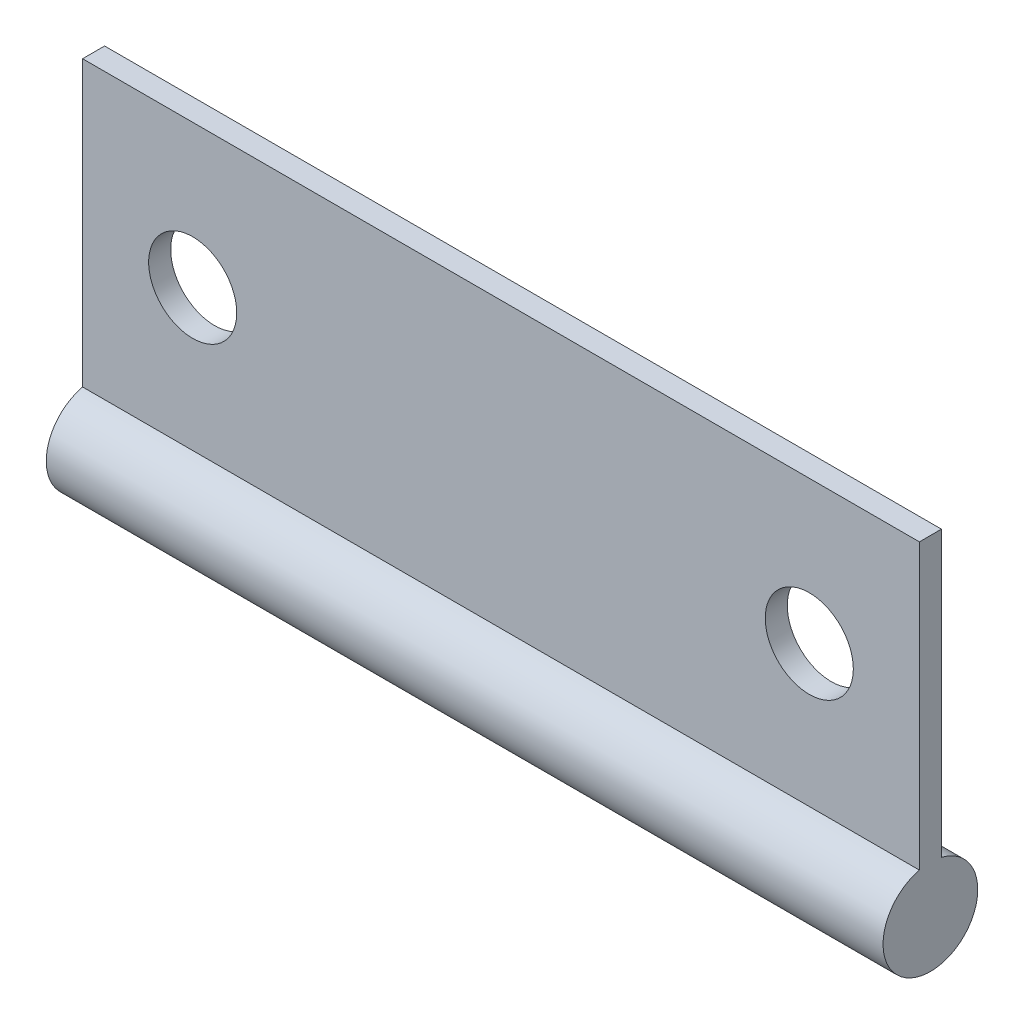
ISO-10303-21;
HEADER;
FILE_DESCRIPTION(('STEP AP214'),'2;1');
FILE_NAME('part.step','',(''),(''),'','','');
FILE_SCHEMA(('AUTOMOTIVE_DESIGN { 1 0 10303 214 1 1 1 1 }'));
ENDSEC;
DATA;
#1=APPLICATION_CONTEXT('core data for automotive mechanical design processes');
#2=APPLICATION_PROTOCOL_DEFINITION('international standard','automotive_design',2000,#1);
#3=PRODUCT_CONTEXT('',#1,'mechanical');
#4=PRODUCT('Part','Part','',(#3));
#5=PRODUCT_RELATED_PRODUCT_CATEGORY('part','',(#4));
#6=PRODUCT_DEFINITION_FORMATION('','',#4);
#7=PRODUCT_DEFINITION_CONTEXT('part definition',#1,'design');
#8=PRODUCT_DEFINITION('design','',#6,#7);
#9=PRODUCT_DEFINITION_SHAPE('','',#8);
#10=(LENGTH_UNIT() NAMED_UNIT(*) SI_UNIT(.MILLI.,.METRE.));
#11=(NAMED_UNIT(*) PLANE_ANGLE_UNIT() SI_UNIT($,.RADIAN.));
#12=(NAMED_UNIT(*) SI_UNIT($,.STERADIAN.) SOLID_ANGLE_UNIT());
#13=UNCERTAINTY_MEASURE_WITH_UNIT(LENGTH_MEASURE(1.E-05),#10,'distance_accuracy_value','');
#14=(GEOMETRIC_REPRESENTATION_CONTEXT(3) GLOBAL_UNCERTAINTY_ASSIGNED_CONTEXT((#13)) GLOBAL_UNIT_ASSIGNED_CONTEXT((#10,
#11,#12)) REPRESENTATION_CONTEXT('',''));
#15=CARTESIAN_POINT('',(0.,0.,0.));
#16=DIRECTION('',(0.,0.,1.));
#17=DIRECTION('',(1.,0.,0.));
#18=AXIS2_PLACEMENT_3D('',#15,#16,#17);
#19=CARTESIAN_POINT('',(0.,0.,1.));
#20=DIRECTION('',(0.,0.,1.));
#21=DIRECTION('',(1.,0.,0.));
#22=AXIS2_PLACEMENT_3D('',#19,#20,#21);
#23=PLANE('',#22);
#24=DIRECTION('',(-1.,0.,0.));
#25=VECTOR('',#24,1.);
#26=CARTESIAN_POINT('',(-7.81848866338462,6.11066564078649,1.));
#27=LINE('',#26,#25);
#28=CARTESIAN_POINT('',(-7.81848866338462,6.11066564078649,1.));
#29=VERTEX_POINT('',#28);
#30=CARTESIAN_POINT('',(-45.8184886633846,6.11066564078649,1.));
#31=VERTEX_POINT('',#30);
#32=EDGE_CURVE('E79',#29,#31,#27,.T.);
#33=ORIENTED_EDGE('',*,*,#32,.F.);
#34=DIRECTION('',(0.,1.,0.));
#35=VECTOR('',#34,1.);
#36=CARTESIAN_POINT('',(-7.81848866338461,19.0196132741538,1.));
#37=LINE('',#36,#35);
#38=CARTESIAN_POINT('',(-7.81848866338461,19.0196132741538,1.));
#39=VERTEX_POINT('',#38);
#40=EDGE_CURVE('E96',#29,#39,#37,.T.);
#41=ORIENTED_EDGE('',*,*,#40,.T.);
#42=DIRECTION('',(-1.,0.,0.));
#43=VECTOR('',#42,1.);
#44=CARTESIAN_POINT('',(-45.8184886633846,19.0196132741538,1.));
#45=LINE('',#44,#43);
#46=CARTESIAN_POINT('',(-45.8184886633846,19.0196132741538,1.));
#47=VERTEX_POINT('',#46);
#48=EDGE_CURVE('E52',#39,#47,#45,.T.);
#49=ORIENTED_EDGE('',*,*,#48,.T.);
#50=DIRECTION('',(0.,-1.,0.));
#51=VECTOR('',#50,1.);
#52=CARTESIAN_POINT('',(-45.8184886633846,19.0196132741538,1.));
#53=LINE('',#52,#51);
#54=EDGE_CURVE('E91',#47,#31,#53,.T.);
#55=ORIENTED_EDGE('',*,*,#54,.T.);
#56=EDGE_LOOP('',(#33,#41,#49,#55));
#57=FACE_BOUND('',#56,.T.);
#58=CARTESIAN_POINT('',(-40.8184886633846,12.5196132741538,1.));
#59=DIRECTION('',(0.,0.,1.));
#60=DIRECTION('',(1.,0.,0.));
#61=AXIS2_PLACEMENT_3D('',#58,#59,#60);
#62=CIRCLE('',#61,2.);
#63=CARTESIAN_POINT('',(-38.8184886633846,12.5196132741538,1.));
#64=VERTEX_POINT('',#63);
#65=EDGE_CURVE('E107',#64,#64,#62,.T.);
#66=ORIENTED_EDGE('',*,*,#65,.F.);
#67=EDGE_LOOP('',(#66));
#68=FACE_BOUND('',#67,.T.);
#69=CARTESIAN_POINT('',(-12.8184886633846,12.5196132741538,1.));
#70=DIRECTION('',(0.,0.,1.));
#71=DIRECTION('',(1.,0.,0.));
#72=AXIS2_PLACEMENT_3D('',#69,#70,#71);
#73=CIRCLE('',#72,2.);
#74=CARTESIAN_POINT('',(-10.8184886633846,12.5196132741538,1.));
#75=VERTEX_POINT('',#74);
#76=EDGE_CURVE('E116',#75,#75,#73,.T.);
#77=ORIENTED_EDGE('',*,*,#76,.F.);
#78=EDGE_LOOP('',(#77));
#79=FACE_BOUND('',#78,.T.);
#80=ADVANCED_FACE('F35',(#57,#68,#79),#23,.T.);
#81=CARTESIAN_POINT('',(0.,0.,0.));
#82=DIRECTION('',(0.,0.,1.));
#83=DIRECTION('',(1.,0.,0.));
#84=AXIS2_PLACEMENT_3D('',#81,#82,#83);
#85=PLANE('',#84);
#86=DIRECTION('',(0.,1.,0.));
#87=VECTOR('',#86,1.);
#88=CARTESIAN_POINT('',(-7.81848866338461,19.0196132741538,0.));
#89=LINE('',#88,#87);
#90=CARTESIAN_POINT('',(-7.81848866338462,6.11066564078649,0.));
#91=VERTEX_POINT('',#90);
#92=CARTESIAN_POINT('',(-7.81848866338461,19.0196132741538,0.));
#93=VERTEX_POINT('',#92);
#94=EDGE_CURVE('E63',#91,#93,#89,.T.);
#95=ORIENTED_EDGE('',*,*,#94,.F.);
#96=DIRECTION('',(-1.,0.,0.));
#97=VECTOR('',#96,1.);
#98=CARTESIAN_POINT('',(-7.81848866338462,6.11066564078649,0.));
#99=LINE('',#98,#97);
#100=CARTESIAN_POINT('',(-45.8184886633846,6.11066564078649,0.));
#101=VERTEX_POINT('',#100);
#102=EDGE_CURVE('E71',#91,#101,#99,.T.);
#103=ORIENTED_EDGE('',*,*,#102,.T.);
#104=DIRECTION('',(0.,-1.,0.));
#105=VECTOR('',#104,1.);
#106=CARTESIAN_POINT('',(-45.8184886633846,19.0196132741538,0.));
#107=LINE('',#106,#105);
#108=CARTESIAN_POINT('',(-45.8184886633846,19.0196132741538,0.));
#109=VERTEX_POINT('',#108);
#110=EDGE_CURVE('E93',#109,#101,#107,.T.);
#111=ORIENTED_EDGE('',*,*,#110,.F.);
#112=DIRECTION('',(-1.,0.,0.));
#113=VECTOR('',#112,1.);
#114=CARTESIAN_POINT('',(-45.8184886633846,19.0196132741538,0.));
#115=LINE('',#114,#113);
#116=EDGE_CURVE('E97',#93,#109,#115,.T.);
#117=ORIENTED_EDGE('',*,*,#116,.F.);
#118=EDGE_LOOP('',(#95,#103,#111,#117));
#119=FACE_BOUND('',#118,.T.);
#120=CARTESIAN_POINT('',(-40.8184886633846,12.5196132741538,0.));
#121=DIRECTION('',(0.,0.,1.));
#122=DIRECTION('',(1.,0.,0.));
#123=AXIS2_PLACEMENT_3D('',#120,#121,#122);
#124=CIRCLE('',#123,2.);
#125=CARTESIAN_POINT('',(-38.8184886633846,12.5196132741538,0.));
#126=VERTEX_POINT('',#125);
#127=EDGE_CURVE('E102',#126,#126,#124,.T.);
#128=ORIENTED_EDGE('',*,*,#127,.T.);
#129=EDGE_LOOP('',(#128));
#130=FACE_BOUND('',#129,.T.);
#131=CARTESIAN_POINT('',(-12.8184886633846,12.5196132741538,0.));
#132=DIRECTION('',(0.,0.,1.));
#133=DIRECTION('',(1.,0.,0.));
#134=AXIS2_PLACEMENT_3D('',#131,#132,#133);
#135=CIRCLE('',#134,2.);
#136=CARTESIAN_POINT('',(-10.8184886633846,12.5196132741538,0.));
#137=VERTEX_POINT('',#136);
#138=EDGE_CURVE('E85',#137,#137,#135,.T.);
#139=ORIENTED_EDGE('',*,*,#138,.T.);
#140=EDGE_LOOP('',(#139));
#141=FACE_BOUND('',#140,.T.);
#142=ADVANCED_FACE('F111',(#119,#130,#141),#85,.F.);
#143=CARTESIAN_POINT('',(-45.8184886633846,19.0196132741538,1.));
#144=DIRECTION('',(1.,0.,0.));
#145=DIRECTION('',(0.,0.,-1.));
#146=AXIS2_PLACEMENT_3D('',#143,#144,#145);
#147=PLANE('',#146);
#148=ORIENTED_EDGE('',*,*,#110,.T.);
#149=CARTESIAN_POINT('',(-45.8184886633846,4.01961327415384,0.5));
#150=DIRECTION('',(-1.,0.,0.));
#151=DIRECTION('',(0.,0.,1.));
#152=AXIS2_PLACEMENT_3D('',#149,#150,#151);
#153=CIRCLE('',#152,2.15);
#154=EDGE_CURVE('E82',#101,#31,#153,.T.);
#155=ORIENTED_EDGE('',*,*,#154,.T.);
#156=ORIENTED_EDGE('',*,*,#54,.F.);
#157=DIRECTION('',(0.,0.,-1.));
#158=VECTOR('',#157,1.);
#159=CARTESIAN_POINT('',(-45.8184886633846,19.0196132741538,1.));
#160=LINE('',#159,#158);
#161=EDGE_CURVE('E44',#47,#109,#160,.T.);
#162=ORIENTED_EDGE('',*,*,#161,.T.);
#163=EDGE_LOOP('',(#148,#155,#156,#162));
#164=FACE_BOUND('',#163,.T.);
#165=ADVANCED_FACE('F37',(#164),#147,.F.);
#166=CARTESIAN_POINT('',(-7.81848866338461,19.0196132741538,1.));
#167=DIRECTION('',(-1.,0.,0.));
#168=DIRECTION('',(0.,-1.,0.));
#169=AXIS2_PLACEMENT_3D('',#166,#167,#168);
#170=PLANE('',#169);
#171=ORIENTED_EDGE('',*,*,#40,.F.);
#172=CARTESIAN_POINT('',(-7.81848866338462,4.01961327415384,0.5));
#173=DIRECTION('',(-1.,0.,0.));
#174=DIRECTION('',(0.,0.,1.));
#175=AXIS2_PLACEMENT_3D('',#172,#173,#174);
#176=CIRCLE('',#175,2.15);
#177=EDGE_CURVE('E83',#91,#29,#176,.T.);
#178=ORIENTED_EDGE('',*,*,#177,.F.);
#179=ORIENTED_EDGE('',*,*,#94,.T.);
#180=DIRECTION('',(0.,0.,-1.));
#181=VECTOR('',#180,1.);
#182=CARTESIAN_POINT('',(-7.81848866338461,19.0196132741538,1.));
#183=LINE('',#182,#181);
#184=EDGE_CURVE('E11',#39,#93,#183,.T.);
#185=ORIENTED_EDGE('',*,*,#184,.F.);
#186=EDGE_LOOP('',(#171,#178,#179,#185));
#187=FACE_BOUND('',#186,.T.);
#188=ADVANCED_FACE('F138',(#187),#170,.F.);
#189=CARTESIAN_POINT('',(-45.8184886633846,19.0196132741538,1.));
#190=DIRECTION('',(0.,-1.,0.));
#191=DIRECTION('',(0.,0.,-1.));
#192=AXIS2_PLACEMENT_3D('',#189,#190,#191);
#193=PLANE('',#192);
#194=ORIENTED_EDGE('',*,*,#116,.T.);
#195=ORIENTED_EDGE('',*,*,#161,.F.);
#196=ORIENTED_EDGE('',*,*,#48,.F.);
#197=ORIENTED_EDGE('',*,*,#184,.T.);
#198=EDGE_LOOP('',(#194,#195,#196,#197));
#199=FACE_BOUND('',#198,.T.);
#200=ADVANCED_FACE('F130',(#199),#193,.F.);
#201=CARTESIAN_POINT('',(-40.8184886633846,12.5196132741538,1.));
#202=DIRECTION('',(0.,0.,-1.));
#203=DIRECTION('',(-1.,0.,0.));
#204=AXIS2_PLACEMENT_3D('',#201,#202,#203);
#205=CYLINDRICAL_SURFACE('',#204,2.);
#206=ORIENTED_EDGE('',*,*,#65,.T.);
#207=EDGE_LOOP('',(#206));
#208=FACE_BOUND('',#207,.T.);
#209=ORIENTED_EDGE('',*,*,#127,.F.);
#210=EDGE_LOOP('',(#209));
#211=FACE_BOUND('',#210,.T.);
#212=ADVANCED_FACE('F127',(#208,#211),#205,.F.);
#213=CARTESIAN_POINT('',(-12.8184886633846,12.5196132741538,1.));
#214=DIRECTION('',(0.,0.,-1.));
#215=DIRECTION('',(-1.,0.,0.));
#216=AXIS2_PLACEMENT_3D('',#213,#214,#215);
#217=CYLINDRICAL_SURFACE('',#216,2.);
#218=ORIENTED_EDGE('',*,*,#76,.T.);
#219=EDGE_LOOP('',(#218));
#220=FACE_BOUND('',#219,.T.);
#221=ORIENTED_EDGE('',*,*,#138,.F.);
#222=EDGE_LOOP('',(#221));
#223=FACE_BOUND('',#222,.T.);
#224=ADVANCED_FACE('F129',(#220,#223),#217,.F.);
#225=CARTESIAN_POINT('',(-7.81848866338462,4.01961327415384,0.5));
#226=DIRECTION('',(-1.,0.,0.));
#227=DIRECTION('',(0.,0.,1.));
#228=AXIS2_PLACEMENT_3D('',#225,#226,#227);
#229=CYLINDRICAL_SURFACE('',#228,2.15);
#230=ORIENTED_EDGE('',*,*,#177,.T.);
#231=ORIENTED_EDGE('',*,*,#32,.T.);
#232=ORIENTED_EDGE('',*,*,#154,.F.);
#233=ORIENTED_EDGE('',*,*,#102,.F.);
#234=EDGE_LOOP('',(#230,#231,#232,#233));
#235=FACE_BOUND('',#234,.T.);
#236=ADVANCED_FACE('F81',(#235),#229,.T.);
#237=CLOSED_SHELL('',(#80,#142,#165,#188,#200,#212,#224,#236));
#238=MANIFOLD_SOLID_BREP('B2',#237);
#239=ADVANCED_BREP_SHAPE_REPRESENTATION('',(#18,#238),#14);
#240=SHAPE_DEFINITION_REPRESENTATION(#9,#239);
ENDSEC;
END-ISO-10303-21;
